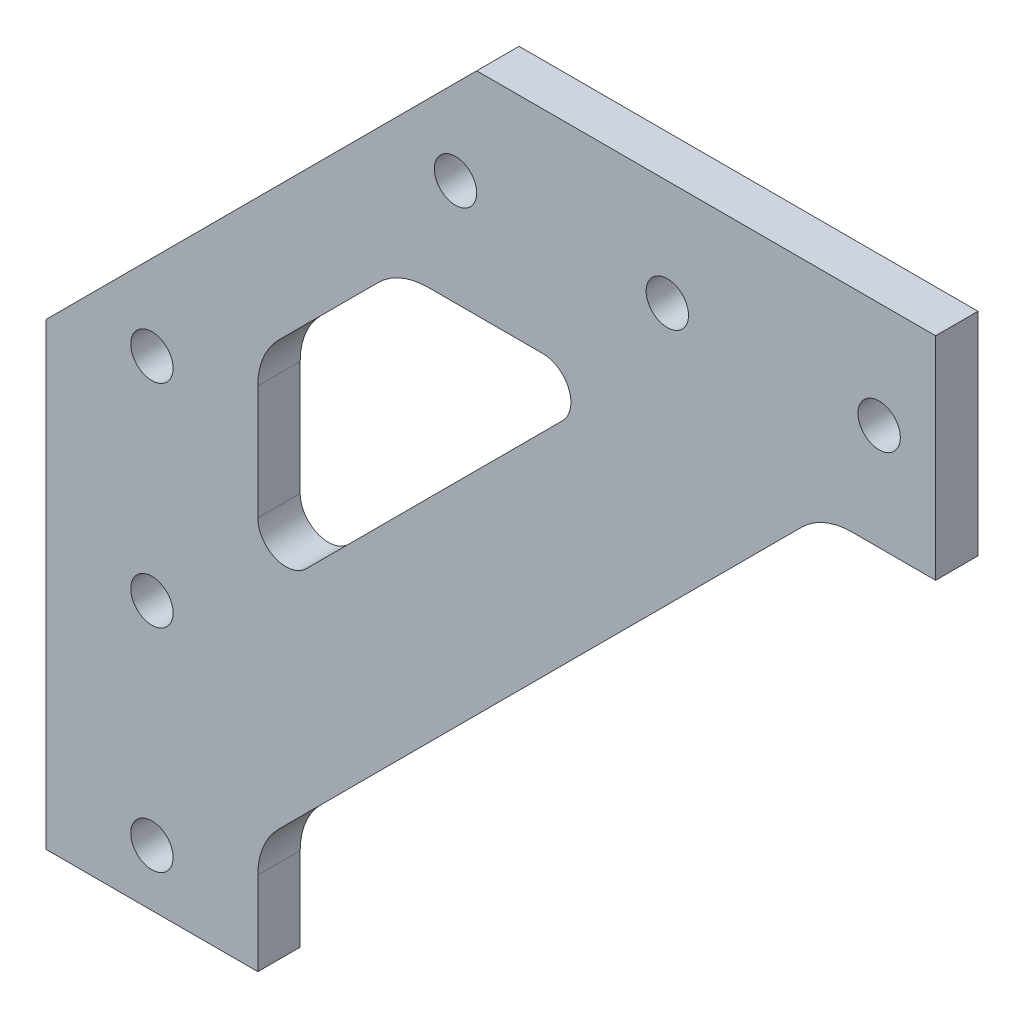
ISO-10303-21;
HEADER;
FILE_DESCRIPTION(('STEP AP214'),'2;1');
FILE_NAME('part.step','',(''),(''),'','','');
FILE_SCHEMA(('AUTOMOTIVE_DESIGN { 1 0 10303 214 1 1 1 1 }'));
ENDSEC;
DATA;
#1=APPLICATION_CONTEXT('core data for automotive mechanical design processes');
#2=APPLICATION_PROTOCOL_DEFINITION('international standard','automotive_design',2000,#1);
#3=PRODUCT_CONTEXT('',#1,'mechanical');
#4=PRODUCT('Part','Part','',(#3));
#5=PRODUCT_RELATED_PRODUCT_CATEGORY('part','',(#4));
#6=PRODUCT_DEFINITION_FORMATION('','',#4);
#7=PRODUCT_DEFINITION_CONTEXT('part definition',#1,'design');
#8=PRODUCT_DEFINITION('design','',#6,#7);
#9=PRODUCT_DEFINITION_SHAPE('','',#8);
#10=(LENGTH_UNIT() NAMED_UNIT(*) SI_UNIT(.MILLI.,.METRE.));
#11=(NAMED_UNIT(*) PLANE_ANGLE_UNIT() SI_UNIT($,.RADIAN.));
#12=(NAMED_UNIT(*) SI_UNIT($,.STERADIAN.) SOLID_ANGLE_UNIT());
#13=UNCERTAINTY_MEASURE_WITH_UNIT(LENGTH_MEASURE(1.E-05),#10,'distance_accuracy_value','');
#14=(GEOMETRIC_REPRESENTATION_CONTEXT(3) GLOBAL_UNCERTAINTY_ASSIGNED_CONTEXT((#13)) GLOBAL_UNIT_ASSIGNED_CONTEXT((#10,
#11,#12)) REPRESENTATION_CONTEXT('',''));
#15=CARTESIAN_POINT('',(0.,0.,0.));
#16=DIRECTION('',(0.,0.,1.));
#17=DIRECTION('',(1.,0.,0.));
#18=AXIS2_PLACEMENT_3D('',#15,#16,#17);
#19=CARTESIAN_POINT('',(26.5710678118655,-20.,3.));
#20=DIRECTION('',(0.,0.,1.));
#21=DIRECTION('',(1.,0.,0.));
#22=AXIS2_PLACEMENT_3D('',#19,#20,#21);
#23=PLANE('',#22);
#24=CARTESIAN_POINT('',(28.5,-7.5,3.));
#25=DIRECTION('',(0.,0.,1.));
#26=DIRECTION('',(1.,0.,0.));
#27=AXIS2_PLACEMENT_3D('',#24,#25,#26);
#28=CIRCLE('',#27,1.5);
#29=CARTESIAN_POINT('',(30.,-7.5,3.));
#30=VERTEX_POINT('',#29);
#31=EDGE_CURVE('E298',#30,#30,#28,.T.);
#32=ORIENTED_EDGE('',*,*,#31,.F.);
#33=EDGE_LOOP('',(#32));
#34=FACE_BOUND('',#33,.T.);
#35=CARTESIAN_POINT('',(13.5,-7.5,3.));
#36=DIRECTION('',(0.,0.,1.));
#37=DIRECTION('',(1.,0.,0.));
#38=AXIS2_PLACEMENT_3D('',#35,#36,#37);
#39=CIRCLE('',#38,1.5);
#40=CARTESIAN_POINT('',(15.,-7.5,3.));
#41=VERTEX_POINT('',#40);
#42=EDGE_CURVE('E479',#41,#41,#39,.T.);
#43=ORIENTED_EDGE('',*,*,#42,.F.);
#44=EDGE_LOOP('',(#43));
#45=FACE_BOUND('',#44,.T.);
#46=CARTESIAN_POINT('',(-1.5,-7.5,3.));
#47=DIRECTION('',(0.,0.,1.));
#48=DIRECTION('',(1.,0.,0.));
#49=AXIS2_PLACEMENT_3D('',#46,#47,#48);
#50=CIRCLE('',#49,1.5);
#51=CARTESIAN_POINT('',(0.,-7.5,3.));
#52=VERTEX_POINT('',#51);
#53=EDGE_CURVE('E466',#52,#52,#50,.T.);
#54=ORIENTED_EDGE('',*,*,#53,.F.);
#55=EDGE_LOOP('',(#54));
#56=FACE_BOUND('',#55,.T.);
#57=CARTESIAN_POINT('',(-22.9999999999998,-29.,3.));
#58=DIRECTION('',(0.,0.,1.));
#59=DIRECTION('',(1.,0.,0.));
#60=AXIS2_PLACEMENT_3D('',#57,#58,#59);
#61=CIRCLE('',#60,1.5);
#62=CARTESIAN_POINT('',(-21.4999999999998,-29.,3.));
#63=VERTEX_POINT('',#62);
#64=EDGE_CURVE('E480',#63,#63,#61,.T.);
#65=ORIENTED_EDGE('',*,*,#64,.F.);
#66=EDGE_LOOP('',(#65));
#67=FACE_BOUND('',#66,.T.);
#68=CARTESIAN_POINT('',(-22.9999999999998,-44.,3.));
#69=DIRECTION('',(0.,0.,1.));
#70=DIRECTION('',(1.,0.,0.));
#71=AXIS2_PLACEMENT_3D('',#68,#69,#70);
#72=CIRCLE('',#71,1.5);
#73=CARTESIAN_POINT('',(-21.4999999999998,-44.,3.));
#74=VERTEX_POINT('',#73);
#75=EDGE_CURVE('E485',#74,#74,#72,.T.);
#76=ORIENTED_EDGE('',*,*,#75,.F.);
#77=EDGE_LOOP('',(#76));
#78=FACE_BOUND('',#77,.T.);
#79=CARTESIAN_POINT('',(-22.9999999999998,-59.,3.));
#80=DIRECTION('',(0.,0.,1.));
#81=DIRECTION('',(1.,0.,0.));
#82=AXIS2_PLACEMENT_3D('',#79,#80,#81);
#83=CIRCLE('',#82,1.5);
#84=CARTESIAN_POINT('',(-21.4999999999998,-59.,3.));
#85=VERTEX_POINT('',#84);
#86=EDGE_CURVE('E490',#85,#85,#83,.T.);
#87=ORIENTED_EDGE('',*,*,#86,.F.);
#88=EDGE_LOOP('',(#87));
#89=FACE_BOUND('',#88,.T.);
#90=DIRECTION('',(-1.,0.,0.));
#91=VECTOR('',#90,1.);
#92=CARTESIAN_POINT('',(0.,0.,3.));
#93=LINE('',#92,#91);
#94=CARTESIAN_POINT('',(32.5,0.,3.));
#95=VERTEX_POINT('',#94);
#96=CARTESIAN_POINT('',(0.,0.,3.));
#97=VERTEX_POINT('',#96);
#98=EDGE_CURVE('E227',#95,#97,#93,.T.);
#99=ORIENTED_EDGE('',*,*,#98,.T.);
#100=DIRECTION('',(-0.707106781186546,-0.707106781186549,0.));
#101=VECTOR('',#100,1.);
#102=CARTESIAN_POINT('',(-30.4999999999998,-30.5,3.));
#103=LINE('',#102,#101);
#104=CARTESIAN_POINT('',(-30.4999999999998,-30.5,3.));
#105=VERTEX_POINT('',#104);
#106=EDGE_CURVE('E230',#97,#105,#103,.T.);
#107=ORIENTED_EDGE('',*,*,#106,.T.);
#108=DIRECTION('',(0.,-1.,0.));
#109=VECTOR('',#108,1.);
#110=CARTESIAN_POINT('',(-30.4999999999998,-30.5,3.));
#111=LINE('',#110,#109);
#112=CARTESIAN_POINT('',(-30.4999999999998,-63.,3.));
#113=VERTEX_POINT('',#112);
#114=EDGE_CURVE('E233',#105,#113,#111,.T.);
#115=ORIENTED_EDGE('',*,*,#114,.T.);
#116=DIRECTION('',(1.,0.,0.));
#117=VECTOR('',#116,1.);
#118=CARTESIAN_POINT('',(-15.4999999999998,-63.,3.));
#119=LINE('',#118,#117);
#120=CARTESIAN_POINT('',(-15.4999999999998,-63.,3.));
#121=VERTEX_POINT('',#120);
#122=EDGE_CURVE('E235',#113,#121,#119,.T.);
#123=ORIENTED_EDGE('',*,*,#122,.T.);
#124=DIRECTION('',(0.,1.,0.));
#125=VECTOR('',#124,1.);
#126=CARTESIAN_POINT('',(-15.4999999999998,-57.0710678118655,3.));
#127=LINE('',#126,#125);
#128=CARTESIAN_POINT('',(-15.4999999999998,-57.0710678118655,3.));
#129=VERTEX_POINT('',#128);
#130=EDGE_CURVE('E237',#121,#129,#127,.T.);
#131=ORIENTED_EDGE('',*,*,#130,.T.);
#132=CARTESIAN_POINT('',(-10.4999999999998,-57.0710678118655,3.));
#133=DIRECTION('',(0.,0.,-1.));
#134=DIRECTION('',(1.,0.,0.));
#135=AXIS2_PLACEMENT_3D('',#132,#133,#134);
#136=CIRCLE('',#135,5.);
#137=CARTESIAN_POINT('',(-14.0355339059325,-53.5355339059327,3.));
#138=VERTEX_POINT('',#137);
#139=EDGE_CURVE('E239',#129,#138,#136,.T.);
#140=ORIENTED_EDGE('',*,*,#139,.T.);
#141=DIRECTION('',(0.707106781186546,0.707106781186549,0.));
#142=VECTOR('',#141,1.);
#143=CARTESIAN_POINT('',(23.0355339059327,-16.4644660940673,3.));
#144=LINE('',#143,#142);
#145=CARTESIAN_POINT('',(23.0355339059327,-16.4644660940673,3.));
#146=VERTEX_POINT('',#145);
#147=EDGE_CURVE('E241',#138,#146,#144,.T.);
#148=ORIENTED_EDGE('',*,*,#147,.T.);
#149=CARTESIAN_POINT('',(26.5710678118655,-20.,3.));
#150=DIRECTION('',(0.,0.,-1.));
#151=DIRECTION('',(1.,0.,0.));
#152=AXIS2_PLACEMENT_3D('',#149,#150,#151);
#153=CIRCLE('',#152,5.);
#154=CARTESIAN_POINT('',(26.5710678118655,-15.,3.));
#155=VERTEX_POINT('',#154);
#156=EDGE_CURVE('E243',#146,#155,#153,.T.);
#157=ORIENTED_EDGE('',*,*,#156,.T.);
#158=DIRECTION('',(1.,0.,0.));
#159=VECTOR('',#158,1.);
#160=CARTESIAN_POINT('',(32.5,-15.,3.));
#161=LINE('',#160,#159);
#162=CARTESIAN_POINT('',(32.5,-15.,3.));
#163=VERTEX_POINT('',#162);
#164=EDGE_CURVE('E245',#155,#163,#161,.T.);
#165=ORIENTED_EDGE('',*,*,#164,.T.);
#166=DIRECTION('',(0.,1.,0.));
#167=VECTOR('',#166,1.);
#168=CARTESIAN_POINT('',(32.5,0.,3.));
#169=LINE('',#168,#167);
#170=EDGE_CURVE('E247',#163,#95,#169,.T.);
#171=ORIENTED_EDGE('',*,*,#170,.T.);
#172=EDGE_LOOP('',(#99,#107,#115,#123,#131,#140,#148,#157,#165,#171));
#173=FACE_BOUND('',#172,.T.);
#174=DIRECTION('',(0.707106781186545,0.70710678118655,0.));
#175=VECTOR('',#174,1.);
#176=CARTESIAN_POINT('',(-12.0857864376267,-36.5857864376269,3.));
#177=LINE('',#176,#175);
#178=CARTESIAN_POINT('',(-12.0857864376267,-36.5857864376269,3.));
#179=VERTEX_POINT('',#178);
#180=CARTESIAN_POINT('',(6.08578643762694,-18.4142135623731,3.));
#181=VERTEX_POINT('',#180);
#182=EDGE_CURVE('E169',#179,#181,#177,.T.);
#183=ORIENTED_EDGE('',*,*,#182,.F.);
#184=CARTESIAN_POINT('',(-13.4999999999998,-35.1715728752538,3.));
#185=DIRECTION('',(0.,0.,1.));
#186=DIRECTION('',(1.,0.,0.));
#187=AXIS2_PLACEMENT_3D('',#184,#185,#186);
#188=CIRCLE('',#187,2.);
#189=CARTESIAN_POINT('',(-15.4999999999998,-35.1715728752538,3.));
#190=VERTEX_POINT('',#189);
#191=EDGE_CURVE('E161',#190,#179,#188,.T.);
#192=ORIENTED_EDGE('',*,*,#191,.F.);
#193=DIRECTION('',(0.,-1.,0.));
#194=VECTOR('',#193,1.);
#195=CARTESIAN_POINT('',(-15.4999999999998,-35.1715728752538,3.));
#196=LINE('',#195,#194);
#197=CARTESIAN_POINT('',(-15.4999999999998,-27.0710678118654,3.));
#198=VERTEX_POINT('',#197);
#199=EDGE_CURVE('E195',#198,#190,#196,.T.);
#200=ORIENTED_EDGE('',*,*,#199,.F.);
#201=CARTESIAN_POINT('',(-10.4999999999998,-27.0710678118654,3.));
#202=DIRECTION('',(0.,0.,1.));
#203=DIRECTION('',(-1.,0.,0.));
#204=AXIS2_PLACEMENT_3D('',#201,#202,#203);
#205=CIRCLE('',#204,5.);
#206=CARTESIAN_POINT('',(-14.0355339059326,-23.5355339059327,3.));
#207=VERTEX_POINT('',#206);
#208=EDGE_CURVE('E193',#207,#198,#205,.T.);
#209=ORIENTED_EDGE('',*,*,#208,.F.);
#210=DIRECTION('',(-0.70710678118654,-0.707106781186555,0.));
#211=VECTOR('',#210,1.);
#212=CARTESIAN_POINT('',(-6.96446609406726,-16.4644660940673,3.));
#213=LINE('',#212,#211);
#214=CARTESIAN_POINT('',(-6.96446609406726,-16.4644660940673,3.));
#215=VERTEX_POINT('',#214);
#216=EDGE_CURVE('E191',#215,#207,#213,.T.);
#217=ORIENTED_EDGE('',*,*,#216,.F.);
#218=CARTESIAN_POINT('',(-3.42893218813449,-20.,3.));
#219=DIRECTION('',(0.,0.,1.));
#220=DIRECTION('',(1.,0.,0.));
#221=AXIS2_PLACEMENT_3D('',#218,#219,#220);
#222=CIRCLE('',#221,5.);
#223=CARTESIAN_POINT('',(-3.42893218813449,-15.,3.));
#224=VERTEX_POINT('',#223);
#225=EDGE_CURVE('E189',#224,#215,#222,.T.);
#226=ORIENTED_EDGE('',*,*,#225,.F.);
#227=DIRECTION('',(-1.,0.,0.));
#228=VECTOR('',#227,1.);
#229=CARTESIAN_POINT('',(4.67157287525384,-15.,3.));
#230=LINE('',#229,#228);
#231=CARTESIAN_POINT('',(4.67157287525384,-15.,3.));
#232=VERTEX_POINT('',#231);
#233=EDGE_CURVE('E184',#232,#224,#230,.T.);
#234=ORIENTED_EDGE('',*,*,#233,.F.);
#235=CARTESIAN_POINT('',(4.67157287525384,-17.,3.));
#236=DIRECTION('',(0.,0.,1.));
#237=DIRECTION('',(1.,0.,0.));
#238=AXIS2_PLACEMENT_3D('',#235,#236,#237);
#239=CIRCLE('',#238,2.);
#240=EDGE_CURVE('E182',#181,#232,#239,.T.);
#241=ORIENTED_EDGE('',*,*,#240,.F.);
#242=EDGE_LOOP('',(#183,#192,#200,#209,#217,#226,#234,#241));
#243=FACE_BOUND('',#242,.T.);
#244=ADVANCED_FACE('F34',(#34,#45,#56,#67,#78,#89,#173,#243),#23,.T.);
#245=CARTESIAN_POINT('',(26.5710678118655,-20.,0.));
#246=DIRECTION('',(0.,0.,1.));
#247=DIRECTION('',(1.,0.,0.));
#248=AXIS2_PLACEMENT_3D('',#245,#246,#247);
#249=PLANE('',#248);
#250=CARTESIAN_POINT('',(28.5,-7.5,0.));
#251=DIRECTION('',(0.,0.,1.));
#252=DIRECTION('',(1.,0.,0.));
#253=AXIS2_PLACEMENT_3D('',#250,#251,#252);
#254=CIRCLE('',#253,1.5);
#255=CARTESIAN_POINT('',(30.,-7.5,0.));
#256=VERTEX_POINT('',#255);
#257=EDGE_CURVE('E38',#256,#256,#254,.T.);
#258=ORIENTED_EDGE('',*,*,#257,.T.);
#259=EDGE_LOOP('',(#258));
#260=FACE_BOUND('',#259,.T.);
#261=CARTESIAN_POINT('',(13.5,-7.5,0.));
#262=DIRECTION('',(0.,0.,1.));
#263=DIRECTION('',(1.,0.,0.));
#264=AXIS2_PLACEMENT_3D('',#261,#262,#263);
#265=CIRCLE('',#264,1.5);
#266=CARTESIAN_POINT('',(15.,-7.5,0.));
#267=VERTEX_POINT('',#266);
#268=EDGE_CURVE('E306',#267,#267,#265,.T.);
#269=ORIENTED_EDGE('',*,*,#268,.T.);
#270=EDGE_LOOP('',(#269));
#271=FACE_BOUND('',#270,.T.);
#272=CARTESIAN_POINT('',(-1.5,-7.5,0.));
#273=DIRECTION('',(0.,0.,1.));
#274=DIRECTION('',(1.,0.,0.));
#275=AXIS2_PLACEMENT_3D('',#272,#273,#274);
#276=CIRCLE('',#275,1.5);
#277=CARTESIAN_POINT('',(0.,-7.5,0.));
#278=VERTEX_POINT('',#277);
#279=EDGE_CURVE('E304',#278,#278,#276,.T.);
#280=ORIENTED_EDGE('',*,*,#279,.T.);
#281=EDGE_LOOP('',(#280));
#282=FACE_BOUND('',#281,.T.);
#283=CARTESIAN_POINT('',(-22.9999999999998,-29.,0.));
#284=DIRECTION('',(0.,0.,1.));
#285=DIRECTION('',(1.,0.,0.));
#286=AXIS2_PLACEMENT_3D('',#283,#284,#285);
#287=CIRCLE('',#286,1.5);
#288=CARTESIAN_POINT('',(-21.4999999999998,-29.,0.));
#289=VERTEX_POINT('',#288);
#290=EDGE_CURVE('E301',#289,#289,#287,.T.);
#291=ORIENTED_EDGE('',*,*,#290,.T.);
#292=EDGE_LOOP('',(#291));
#293=FACE_BOUND('',#292,.T.);
#294=CARTESIAN_POINT('',(-22.9999999999998,-44.,0.));
#295=DIRECTION('',(0.,0.,1.));
#296=DIRECTION('',(1.,0.,0.));
#297=AXIS2_PLACEMENT_3D('',#294,#295,#296);
#298=CIRCLE('',#297,1.5);
#299=CARTESIAN_POINT('',(-21.4999999999998,-44.,0.));
#300=VERTEX_POINT('',#299);
#301=EDGE_CURVE('E297',#300,#300,#298,.T.);
#302=ORIENTED_EDGE('',*,*,#301,.T.);
#303=EDGE_LOOP('',(#302));
#304=FACE_BOUND('',#303,.T.);
#305=CARTESIAN_POINT('',(-22.9999999999998,-59.,0.));
#306=DIRECTION('',(0.,0.,1.));
#307=DIRECTION('',(1.,0.,0.));
#308=AXIS2_PLACEMENT_3D('',#305,#306,#307);
#309=CIRCLE('',#308,1.5);
#310=CARTESIAN_POINT('',(-21.4999999999998,-59.,0.));
#311=VERTEX_POINT('',#310);
#312=EDGE_CURVE('E294',#311,#311,#309,.T.);
#313=ORIENTED_EDGE('',*,*,#312,.T.);
#314=EDGE_LOOP('',(#313));
#315=FACE_BOUND('',#314,.T.);
#316=DIRECTION('',(-1.,0.,0.));
#317=VECTOR('',#316,1.);
#318=CARTESIAN_POINT('',(0.,0.,0.));
#319=LINE('',#318,#317);
#320=CARTESIAN_POINT('',(32.5,0.,0.));
#321=VERTEX_POINT('',#320);
#322=CARTESIAN_POINT('',(0.,0.,0.));
#323=VERTEX_POINT('',#322);
#324=EDGE_CURVE('E177',#321,#323,#319,.T.);
#325=ORIENTED_EDGE('',*,*,#324,.F.);
#326=DIRECTION('',(0.,1.,0.));
#327=VECTOR('',#326,1.);
#328=CARTESIAN_POINT('',(32.5,0.,0.));
#329=LINE('',#328,#327);
#330=CARTESIAN_POINT('',(32.5,-15.,0.));
#331=VERTEX_POINT('',#330);
#332=EDGE_CURVE('E231',#331,#321,#329,.T.);
#333=ORIENTED_EDGE('',*,*,#332,.F.);
#334=DIRECTION('',(1.,0.,0.));
#335=VECTOR('',#334,1.);
#336=CARTESIAN_POINT('',(32.5,-15.,0.));
#337=LINE('',#336,#335);
#338=CARTESIAN_POINT('',(26.5710678118655,-15.,0.));
#339=VERTEX_POINT('',#338);
#340=EDGE_CURVE('E266',#339,#331,#337,.T.);
#341=ORIENTED_EDGE('',*,*,#340,.F.);
#342=CARTESIAN_POINT('',(26.5710678118655,-20.,0.));
#343=DIRECTION('',(0.,0.,-1.));
#344=DIRECTION('',(1.,0.,0.));
#345=AXIS2_PLACEMENT_3D('',#342,#343,#344);
#346=CIRCLE('',#345,5.);
#347=CARTESIAN_POINT('',(23.0355339059327,-16.4644660940673,0.));
#348=VERTEX_POINT('',#347);
#349=EDGE_CURVE('E264',#348,#339,#346,.T.);
#350=ORIENTED_EDGE('',*,*,#349,.F.);
#351=DIRECTION('',(0.707106781186546,0.707106781186549,0.));
#352=VECTOR('',#351,1.);
#353=CARTESIAN_POINT('',(23.0355339059327,-16.4644660940673,0.));
#354=LINE('',#353,#352);
#355=CARTESIAN_POINT('',(-14.0355339059325,-53.5355339059327,0.));
#356=VERTEX_POINT('',#355);
#357=EDGE_CURVE('E262',#356,#348,#354,.T.);
#358=ORIENTED_EDGE('',*,*,#357,.F.);
#359=CARTESIAN_POINT('',(-10.4999999999998,-57.0710678118655,0.));
#360=DIRECTION('',(0.,0.,-1.));
#361=DIRECTION('',(1.,0.,0.));
#362=AXIS2_PLACEMENT_3D('',#359,#360,#361);
#363=CIRCLE('',#362,5.);
#364=CARTESIAN_POINT('',(-15.4999999999998,-57.0710678118655,0.));
#365=VERTEX_POINT('',#364);
#366=EDGE_CURVE('E260',#365,#356,#363,.T.);
#367=ORIENTED_EDGE('',*,*,#366,.F.);
#368=DIRECTION('',(0.,1.,0.));
#369=VECTOR('',#368,1.);
#370=CARTESIAN_POINT('',(-15.4999999999998,-57.0710678118655,0.));
#371=LINE('',#370,#369);
#372=CARTESIAN_POINT('',(-15.4999999999998,-63.,0.));
#373=VERTEX_POINT('',#372);
#374=EDGE_CURVE('E258',#373,#365,#371,.T.);
#375=ORIENTED_EDGE('',*,*,#374,.F.);
#376=DIRECTION('',(1.,0.,0.));
#377=VECTOR('',#376,1.);
#378=CARTESIAN_POINT('',(-15.4999999999998,-63.,0.));
#379=LINE('',#378,#377);
#380=CARTESIAN_POINT('',(-30.4999999999998,-63.,0.));
#381=VERTEX_POINT('',#380);
#382=EDGE_CURVE('E256',#381,#373,#379,.T.);
#383=ORIENTED_EDGE('',*,*,#382,.F.);
#384=DIRECTION('',(0.,-1.,0.));
#385=VECTOR('',#384,1.);
#386=CARTESIAN_POINT('',(-30.4999999999998,-30.5,0.));
#387=LINE('',#386,#385);
#388=CARTESIAN_POINT('',(-30.4999999999998,-30.5,0.));
#389=VERTEX_POINT('',#388);
#390=EDGE_CURVE('E254',#389,#381,#387,.T.);
#391=ORIENTED_EDGE('',*,*,#390,.F.);
#392=DIRECTION('',(-0.707106781186546,-0.707106781186549,0.));
#393=VECTOR('',#392,1.);
#394=CARTESIAN_POINT('',(-30.4999999999998,-30.5,0.));
#395=LINE('',#394,#393);
#396=EDGE_CURVE('E252',#323,#389,#395,.T.);
#397=ORIENTED_EDGE('',*,*,#396,.F.);
#398=EDGE_LOOP('',(#325,#333,#341,#350,#358,#367,#375,#383,#391,#397));
#399=FACE_BOUND('',#398,.T.);
#400=CARTESIAN_POINT('',(-13.4999999999998,-35.1715728752538,0.));
#401=DIRECTION('',(0.,0.,1.));
#402=DIRECTION('',(1.,0.,0.));
#403=AXIS2_PLACEMENT_3D('',#400,#401,#402);
#404=CIRCLE('',#403,2.);
#405=CARTESIAN_POINT('',(-15.4999999999998,-35.1715728752538,0.));
#406=VERTEX_POINT('',#405);
#407=CARTESIAN_POINT('',(-12.0857864376267,-36.5857864376269,0.));
#408=VERTEX_POINT('',#407);
#409=EDGE_CURVE('E59',#406,#408,#404,.T.);
#410=ORIENTED_EDGE('',*,*,#409,.T.);
#411=DIRECTION('',(0.707106781186545,0.70710678118655,0.));
#412=VECTOR('',#411,1.);
#413=CARTESIAN_POINT('',(-12.0857864376267,-36.5857864376269,0.));
#414=LINE('',#413,#412);
#415=CARTESIAN_POINT('',(6.08578643762694,-18.4142135623731,0.));
#416=VERTEX_POINT('',#415);
#417=EDGE_CURVE('E176',#408,#416,#414,.T.);
#418=ORIENTED_EDGE('',*,*,#417,.T.);
#419=CARTESIAN_POINT('',(4.67157287525384,-17.,0.));
#420=DIRECTION('',(0.,0.,1.));
#421=DIRECTION('',(1.,0.,0.));
#422=AXIS2_PLACEMENT_3D('',#419,#420,#421);
#423=CIRCLE('',#422,2.);
#424=CARTESIAN_POINT('',(4.67157287525384,-15.,0.));
#425=VERTEX_POINT('',#424);
#426=EDGE_CURVE('E199',#416,#425,#423,.T.);
#427=ORIENTED_EDGE('',*,*,#426,.T.);
#428=DIRECTION('',(-1.,0.,0.));
#429=VECTOR('',#428,1.);
#430=CARTESIAN_POINT('',(4.67157287525384,-15.,0.));
#431=LINE('',#430,#429);
#432=CARTESIAN_POINT('',(-3.42893218813449,-15.,0.));
#433=VERTEX_POINT('',#432);
#434=EDGE_CURVE('E202',#425,#433,#431,.T.);
#435=ORIENTED_EDGE('',*,*,#434,.T.);
#436=CARTESIAN_POINT('',(-3.42893218813449,-20.,0.));
#437=DIRECTION('',(0.,0.,1.));
#438=DIRECTION('',(1.,0.,0.));
#439=AXIS2_PLACEMENT_3D('',#436,#437,#438);
#440=CIRCLE('',#439,5.);
#441=CARTESIAN_POINT('',(-6.96446609406726,-16.4644660940673,0.));
#442=VERTEX_POINT('',#441);
#443=EDGE_CURVE('E205',#433,#442,#440,.T.);
#444=ORIENTED_EDGE('',*,*,#443,.T.);
#445=DIRECTION('',(-0.70710678118654,-0.707106781186555,0.));
#446=VECTOR('',#445,1.);
#447=CARTESIAN_POINT('',(-6.96446609406726,-16.4644660940673,0.));
#448=LINE('',#447,#446);
#449=CARTESIAN_POINT('',(-14.0355339059326,-23.5355339059327,0.));
#450=VERTEX_POINT('',#449);
#451=EDGE_CURVE('E208',#442,#450,#448,.T.);
#452=ORIENTED_EDGE('',*,*,#451,.T.);
#453=CARTESIAN_POINT('',(-10.4999999999998,-27.0710678118654,0.));
#454=DIRECTION('',(0.,0.,1.));
#455=DIRECTION('',(-1.,0.,0.));
#456=AXIS2_PLACEMENT_3D('',#453,#454,#455);
#457=CIRCLE('',#456,5.);
#458=CARTESIAN_POINT('',(-15.4999999999998,-27.0710678118654,0.));
#459=VERTEX_POINT('',#458);
#460=EDGE_CURVE('E211',#450,#459,#457,.T.);
#461=ORIENTED_EDGE('',*,*,#460,.T.);
#462=DIRECTION('',(0.,-1.,0.));
#463=VECTOR('',#462,1.);
#464=CARTESIAN_POINT('',(-15.4999999999998,-35.1715728752538,0.));
#465=LINE('',#464,#463);
#466=EDGE_CURVE('E170',#459,#406,#465,.T.);
#467=ORIENTED_EDGE('',*,*,#466,.T.);
#468=EDGE_LOOP('',(#410,#418,#427,#435,#444,#452,#461,#467));
#469=FACE_BOUND('',#468,.T.);
#470=ADVANCED_FACE('F313',(#260,#271,#282,#293,#304,#315,#399,#469),#249,.F.);
#471=CARTESIAN_POINT('',(0.,0.,3.));
#472=DIRECTION('',(0.,-1.,0.));
#473=DIRECTION('',(0.,0.,-1.));
#474=AXIS2_PLACEMENT_3D('',#471,#472,#473);
#475=PLANE('',#474);
#476=ORIENTED_EDGE('',*,*,#324,.T.);
#477=DIRECTION('',(0.,0.,-1.));
#478=VECTOR('',#477,1.);
#479=CARTESIAN_POINT('',(0.,0.,3.));
#480=LINE('',#479,#478);
#481=EDGE_CURVE('E11',#97,#323,#480,.T.);
#482=ORIENTED_EDGE('',*,*,#481,.F.);
#483=ORIENTED_EDGE('',*,*,#98,.F.);
#484=DIRECTION('',(0.,0.,-1.));
#485=VECTOR('',#484,1.);
#486=CARTESIAN_POINT('',(32.5,0.,3.));
#487=LINE('',#486,#485);
#488=EDGE_CURVE('E249',#95,#321,#487,.T.);
#489=ORIENTED_EDGE('',*,*,#488,.T.);
#490=EDGE_LOOP('',(#476,#482,#483,#489));
#491=FACE_BOUND('',#490,.T.);
#492=ADVANCED_FACE('F36',(#491),#475,.F.);
#493=CARTESIAN_POINT('',(-30.4999999999998,-30.5,3.));
#494=DIRECTION('',(0.707106781186549,-0.707106781186545,0.));
#495=DIRECTION('',(0.707106781186546,0.707106781186549,0.));
#496=AXIS2_PLACEMENT_3D('',#493,#494,#495);
#497=PLANE('',#496);
#498=ORIENTED_EDGE('',*,*,#396,.T.);
#499=DIRECTION('',(0.,0.,-1.));
#500=VECTOR('',#499,1.);
#501=CARTESIAN_POINT('',(-30.4999999999998,-30.5,3.));
#502=LINE('',#501,#500);
#503=EDGE_CURVE('E43',#105,#389,#502,.T.);
#504=ORIENTED_EDGE('',*,*,#503,.F.);
#505=ORIENTED_EDGE('',*,*,#106,.F.);
#506=ORIENTED_EDGE('',*,*,#481,.T.);
#507=EDGE_LOOP('',(#498,#504,#505,#506));
#508=FACE_BOUND('',#507,.T.);
#509=ADVANCED_FACE('F369',(#508),#497,.F.);
#510=CARTESIAN_POINT('',(-30.4999999999998,-30.5,3.));
#511=DIRECTION('',(1.,0.,0.));
#512=DIRECTION('',(0.,1.,0.));
#513=AXIS2_PLACEMENT_3D('',#510,#511,#512);
#514=PLANE('',#513);
#515=ORIENTED_EDGE('',*,*,#390,.T.);
#516=DIRECTION('',(0.,0.,-1.));
#517=VECTOR('',#516,1.);
#518=CARTESIAN_POINT('',(-30.4999999999998,-63.,3.));
#519=LINE('',#518,#517);
#520=EDGE_CURVE('E289',#113,#381,#519,.T.);
#521=ORIENTED_EDGE('',*,*,#520,.F.);
#522=ORIENTED_EDGE('',*,*,#114,.F.);
#523=ORIENTED_EDGE('',*,*,#503,.T.);
#524=EDGE_LOOP('',(#515,#521,#522,#523));
#525=FACE_BOUND('',#524,.T.);
#526=ADVANCED_FACE('F366',(#525),#514,.F.);
#527=CARTESIAN_POINT('',(-15.4999999999998,-63.,3.));
#528=DIRECTION('',(0.,1.,0.));
#529=DIRECTION('',(-1.,0.,0.));
#530=AXIS2_PLACEMENT_3D('',#527,#528,#529);
#531=PLANE('',#530);
#532=ORIENTED_EDGE('',*,*,#382,.T.);
#533=DIRECTION('',(0.,0.,-1.));
#534=VECTOR('',#533,1.);
#535=CARTESIAN_POINT('',(-15.4999999999998,-63.,3.));
#536=LINE('',#535,#534);
#537=EDGE_CURVE('E286',#121,#373,#536,.T.);
#538=ORIENTED_EDGE('',*,*,#537,.F.);
#539=ORIENTED_EDGE('',*,*,#122,.F.);
#540=ORIENTED_EDGE('',*,*,#520,.T.);
#541=EDGE_LOOP('',(#532,#538,#539,#540));
#542=FACE_BOUND('',#541,.T.);
#543=ADVANCED_FACE('F362',(#542),#531,.F.);
#544=CARTESIAN_POINT('',(-15.4999999999998,-57.0710678118655,3.));
#545=DIRECTION('',(-1.,0.,0.));
#546=DIRECTION('',(0.,-1.,0.));
#547=AXIS2_PLACEMENT_3D('',#544,#545,#546);
#548=PLANE('',#547);
#549=ORIENTED_EDGE('',*,*,#374,.T.);
#550=DIRECTION('',(0.,0.,-1.));
#551=VECTOR('',#550,1.);
#552=CARTESIAN_POINT('',(-15.4999999999998,-57.0710678118655,3.));
#553=LINE('',#552,#551);
#554=EDGE_CURVE('E283',#129,#365,#553,.T.);
#555=ORIENTED_EDGE('',*,*,#554,.F.);
#556=ORIENTED_EDGE('',*,*,#130,.F.);
#557=ORIENTED_EDGE('',*,*,#537,.T.);
#558=EDGE_LOOP('',(#549,#555,#556,#557));
#559=FACE_BOUND('',#558,.T.);
#560=ADVANCED_FACE('F358',(#559),#548,.F.);
#561=CARTESIAN_POINT('',(-10.4999999999998,-57.0710678118655,3.));
#562=DIRECTION('',(0.,0.,-1.));
#563=DIRECTION('',(-1.,0.,0.));
#564=AXIS2_PLACEMENT_3D('',#561,#562,#563);
#565=CYLINDRICAL_SURFACE('',#564,5.);
#566=ORIENTED_EDGE('',*,*,#366,.T.);
#567=DIRECTION('',(0.,0.,-1.));
#568=VECTOR('',#567,1.);
#569=CARTESIAN_POINT('',(-14.0355339059325,-53.5355339059327,3.));
#570=LINE('',#569,#568);
#571=EDGE_CURVE('E280',#138,#356,#570,.T.);
#572=ORIENTED_EDGE('',*,*,#571,.F.);
#573=ORIENTED_EDGE('',*,*,#139,.F.);
#574=ORIENTED_EDGE('',*,*,#554,.T.);
#575=EDGE_LOOP('',(#566,#572,#573,#574));
#576=FACE_BOUND('',#575,.T.);
#577=ADVANCED_FACE('F354',(#576),#565,.F.);
#578=CARTESIAN_POINT('',(23.0355339059327,-16.4644660940673,3.));
#579=DIRECTION('',(-0.707106781186549,0.707106781186546,0.));
#580=DIRECTION('',(-0.707106781186546,-0.707106781186549,0.));
#581=AXIS2_PLACEMENT_3D('',#578,#579,#580);
#582=PLANE('',#581);
#583=ORIENTED_EDGE('',*,*,#357,.T.);
#584=DIRECTION('',(0.,0.,-1.));
#585=VECTOR('',#584,1.);
#586=CARTESIAN_POINT('',(23.0355339059327,-16.4644660940673,3.));
#587=LINE('',#586,#585);
#588=EDGE_CURVE('E277',#146,#348,#587,.T.);
#589=ORIENTED_EDGE('',*,*,#588,.F.);
#590=ORIENTED_EDGE('',*,*,#147,.F.);
#591=ORIENTED_EDGE('',*,*,#571,.T.);
#592=EDGE_LOOP('',(#583,#589,#590,#591));
#593=FACE_BOUND('',#592,.T.);
#594=ADVANCED_FACE('F350',(#593),#582,.F.);
#595=CARTESIAN_POINT('',(26.5710678118655,-20.,3.));
#596=DIRECTION('',(0.,0.,-1.));
#597=DIRECTION('',(-1.,0.,0.));
#598=AXIS2_PLACEMENT_3D('',#595,#596,#597);
#599=CYLINDRICAL_SURFACE('',#598,5.);
#600=ORIENTED_EDGE('',*,*,#349,.T.);
#601=DIRECTION('',(0.,0.,-1.));
#602=VECTOR('',#601,1.);
#603=CARTESIAN_POINT('',(26.5710678118655,-15.,3.));
#604=LINE('',#603,#602);
#605=EDGE_CURVE('E274',#155,#339,#604,.T.);
#606=ORIENTED_EDGE('',*,*,#605,.F.);
#607=ORIENTED_EDGE('',*,*,#156,.F.);
#608=ORIENTED_EDGE('',*,*,#588,.T.);
#609=EDGE_LOOP('',(#600,#606,#607,#608));
#610=FACE_BOUND('',#609,.T.);
#611=ADVANCED_FACE('F346',(#610),#599,.F.);
#612=CARTESIAN_POINT('',(32.5,-15.,3.));
#613=DIRECTION('',(0.,1.,0.));
#614=DIRECTION('',(0.,0.,1.));
#615=AXIS2_PLACEMENT_3D('',#612,#613,#614);
#616=PLANE('',#615);
#617=ORIENTED_EDGE('',*,*,#340,.T.);
#618=DIRECTION('',(0.,0.,-1.));
#619=VECTOR('',#618,1.);
#620=CARTESIAN_POINT('',(32.5,-15.,3.));
#621=LINE('',#620,#619);
#622=EDGE_CURVE('E271',#163,#331,#621,.T.);
#623=ORIENTED_EDGE('',*,*,#622,.F.);
#624=ORIENTED_EDGE('',*,*,#164,.F.);
#625=ORIENTED_EDGE('',*,*,#605,.T.);
#626=EDGE_LOOP('',(#617,#623,#624,#625));
#627=FACE_BOUND('',#626,.T.);
#628=ADVANCED_FACE('F342',(#627),#616,.F.);
#629=CARTESIAN_POINT('',(32.5,0.,3.));
#630=DIRECTION('',(-1.,0.,0.));
#631=DIRECTION('',(0.,0.,1.));
#632=AXIS2_PLACEMENT_3D('',#629,#630,#631);
#633=PLANE('',#632);
#634=ORIENTED_EDGE('',*,*,#332,.T.);
#635=ORIENTED_EDGE('',*,*,#488,.F.);
#636=ORIENTED_EDGE('',*,*,#170,.F.);
#637=ORIENTED_EDGE('',*,*,#622,.T.);
#638=EDGE_LOOP('',(#634,#635,#636,#637));
#639=FACE_BOUND('',#638,.T.);
#640=ADVANCED_FACE('F339',(#639),#633,.F.);
#641=CARTESIAN_POINT('',(-13.4999999999998,-35.1715728752538,3.));
#642=DIRECTION('',(0.,0.,-1.));
#643=DIRECTION('',(-1.,0.,0.));
#644=AXIS2_PLACEMENT_3D('',#641,#642,#643);
#645=CYLINDRICAL_SURFACE('',#644,2.);
#646=ORIENTED_EDGE('',*,*,#409,.F.);
#647=DIRECTION('',(0.,0.,-1.));
#648=VECTOR('',#647,1.);
#649=CARTESIAN_POINT('',(-15.4999999999998,-35.1715728752538,3.));
#650=LINE('',#649,#648);
#651=EDGE_CURVE('E165',#190,#406,#650,.T.);
#652=ORIENTED_EDGE('',*,*,#651,.F.);
#653=ORIENTED_EDGE('',*,*,#191,.T.);
#654=DIRECTION('',(0.,0.,-1.));
#655=VECTOR('',#654,1.);
#656=CARTESIAN_POINT('',(-12.0857864376267,-36.5857864376269,3.));
#657=LINE('',#656,#655);
#658=EDGE_CURVE('E164',#179,#408,#657,.T.);
#659=ORIENTED_EDGE('',*,*,#658,.T.);
#660=EDGE_LOOP('',(#646,#652,#653,#659));
#661=FACE_BOUND('',#660,.T.);
#662=ADVANCED_FACE('F163',(#661),#645,.F.);
#663=CARTESIAN_POINT('',(-12.0857864376267,-36.5857864376269,3.));
#664=DIRECTION('',(-0.70710678118655,0.707106781186545,0.));
#665=DIRECTION('',(-0.707106781186545,-0.70710678118655,0.));
#666=AXIS2_PLACEMENT_3D('',#663,#664,#665);
#667=PLANE('',#666);
#668=ORIENTED_EDGE('',*,*,#417,.F.);
#669=ORIENTED_EDGE('',*,*,#658,.F.);
#670=ORIENTED_EDGE('',*,*,#182,.T.);
#671=DIRECTION('',(0.,0.,-1.));
#672=VECTOR('',#671,1.);
#673=CARTESIAN_POINT('',(6.08578643762694,-18.4142135623731,3.));
#674=LINE('',#673,#672);
#675=EDGE_CURVE('E178',#181,#416,#674,.T.);
#676=ORIENTED_EDGE('',*,*,#675,.T.);
#677=EDGE_LOOP('',(#668,#669,#670,#676));
#678=FACE_BOUND('',#677,.T.);
#679=ADVANCED_FACE('F173',(#678),#667,.T.);
#680=CARTESIAN_POINT('',(4.67157287525384,-17.,3.));
#681=DIRECTION('',(0.,0.,-1.));
#682=DIRECTION('',(-1.,0.,0.));
#683=AXIS2_PLACEMENT_3D('',#680,#681,#682);
#684=CYLINDRICAL_SURFACE('',#683,2.);
#685=ORIENTED_EDGE('',*,*,#426,.F.);
#686=ORIENTED_EDGE('',*,*,#675,.F.);
#687=ORIENTED_EDGE('',*,*,#240,.T.);
#688=DIRECTION('',(0.,0.,-1.));
#689=VECTOR('',#688,1.);
#690=CARTESIAN_POINT('',(4.67157287525384,-15.,3.));
#691=LINE('',#690,#689);
#692=EDGE_CURVE('E224',#232,#425,#691,.T.);
#693=ORIENTED_EDGE('',*,*,#692,.T.);
#694=EDGE_LOOP('',(#685,#686,#687,#693));
#695=FACE_BOUND('',#694,.T.);
#696=ADVANCED_FACE('F430',(#695),#684,.F.);
#697=CARTESIAN_POINT('',(4.67157287525384,-15.,3.));
#698=DIRECTION('',(0.,-1.,0.));
#699=DIRECTION('',(0.,0.,-1.));
#700=AXIS2_PLACEMENT_3D('',#697,#698,#699);
#701=PLANE('',#700);
#702=ORIENTED_EDGE('',*,*,#434,.F.);
#703=ORIENTED_EDGE('',*,*,#692,.F.);
#704=ORIENTED_EDGE('',*,*,#233,.T.);
#705=DIRECTION('',(0.,0.,-1.));
#706=VECTOR('',#705,1.);
#707=CARTESIAN_POINT('',(-3.42893218813449,-15.,3.));
#708=LINE('',#707,#706);
#709=EDGE_CURVE('E222',#224,#433,#708,.T.);
#710=ORIENTED_EDGE('',*,*,#709,.T.);
#711=EDGE_LOOP('',(#702,#703,#704,#710));
#712=FACE_BOUND('',#711,.T.);
#713=ADVANCED_FACE('F427',(#712),#701,.T.);
#714=CARTESIAN_POINT('',(-3.42893218813449,-20.,3.));
#715=DIRECTION('',(0.,0.,-1.));
#716=DIRECTION('',(-1.,0.,0.));
#717=AXIS2_PLACEMENT_3D('',#714,#715,#716);
#718=CYLINDRICAL_SURFACE('',#717,5.);
#719=ORIENTED_EDGE('',*,*,#443,.F.);
#720=ORIENTED_EDGE('',*,*,#709,.F.);
#721=ORIENTED_EDGE('',*,*,#225,.T.);
#722=DIRECTION('',(0.,0.,-1.));
#723=VECTOR('',#722,1.);
#724=CARTESIAN_POINT('',(-6.96446609406726,-16.4644660940673,3.));
#725=LINE('',#724,#723);
#726=EDGE_CURVE('E220',#215,#442,#725,.T.);
#727=ORIENTED_EDGE('',*,*,#726,.T.);
#728=EDGE_LOOP('',(#719,#720,#721,#727));
#729=FACE_BOUND('',#728,.T.);
#730=ADVANCED_FACE('F422',(#729),#718,.F.);
#731=CARTESIAN_POINT('',(-6.96446609406726,-16.4644660940673,3.));
#732=DIRECTION('',(0.707106781186555,-0.70710678118654,0.));
#733=DIRECTION('',(0.70710678118654,0.707106781186555,0.));
#734=AXIS2_PLACEMENT_3D('',#731,#732,#733);
#735=PLANE('',#734);
#736=ORIENTED_EDGE('',*,*,#451,.F.);
#737=ORIENTED_EDGE('',*,*,#726,.F.);
#738=ORIENTED_EDGE('',*,*,#216,.T.);
#739=DIRECTION('',(0.,0.,-1.));
#740=VECTOR('',#739,1.);
#741=CARTESIAN_POINT('',(-14.0355339059326,-23.5355339059327,3.));
#742=LINE('',#741,#740);
#743=EDGE_CURVE('E218',#207,#450,#742,.T.);
#744=ORIENTED_EDGE('',*,*,#743,.T.);
#745=EDGE_LOOP('',(#736,#737,#738,#744));
#746=FACE_BOUND('',#745,.T.);
#747=ADVANCED_FACE('F418',(#746),#735,.T.);
#748=CARTESIAN_POINT('',(-10.4999999999998,-27.0710678118654,3.));
#749=DIRECTION('',(0.,0.,-1.));
#750=DIRECTION('',(-1.,0.,0.));
#751=AXIS2_PLACEMENT_3D('',#748,#749,#750);
#752=CYLINDRICAL_SURFACE('',#751,5.);
#753=ORIENTED_EDGE('',*,*,#460,.F.);
#754=ORIENTED_EDGE('',*,*,#743,.F.);
#755=ORIENTED_EDGE('',*,*,#208,.T.);
#756=DIRECTION('',(0.,0.,-1.));
#757=VECTOR('',#756,1.);
#758=CARTESIAN_POINT('',(-15.4999999999998,-27.0710678118654,3.));
#759=LINE('',#758,#757);
#760=EDGE_CURVE('E51',#198,#459,#759,.T.);
#761=ORIENTED_EDGE('',*,*,#760,.T.);
#762=EDGE_LOOP('',(#753,#754,#755,#761));
#763=FACE_BOUND('',#762,.T.);
#764=ADVANCED_FACE('F415',(#763),#752,.F.);
#765=CARTESIAN_POINT('',(-15.4999999999998,-35.1715728752538,3.));
#766=DIRECTION('',(1.,0.,0.));
#767=DIRECTION('',(0.,0.,-1.));
#768=AXIS2_PLACEMENT_3D('',#765,#766,#767);
#769=PLANE('',#768);
#770=ORIENTED_EDGE('',*,*,#466,.F.);
#771=ORIENTED_EDGE('',*,*,#760,.F.);
#772=ORIENTED_EDGE('',*,*,#199,.T.);
#773=ORIENTED_EDGE('',*,*,#651,.T.);
#774=EDGE_LOOP('',(#770,#771,#772,#773));
#775=FACE_BOUND('',#774,.T.);
#776=ADVANCED_FACE('F409',(#775),#769,.T.);
#777=CARTESIAN_POINT('',(-22.9999999999998,-59.,-7.));
#778=DIRECTION('',(0.,0.,1.));
#779=DIRECTION('',(1.,0.,0.));
#780=AXIS2_PLACEMENT_3D('',#777,#778,#779);
#781=CYLINDRICAL_SURFACE('',#780,1.5);
#782=ORIENTED_EDGE('',*,*,#86,.T.);
#783=EDGE_LOOP('',(#782));
#784=FACE_BOUND('',#783,.T.);
#785=ORIENTED_EDGE('',*,*,#312,.F.);
#786=EDGE_LOOP('',(#785));
#787=FACE_BOUND('',#786,.T.);
#788=ADVANCED_FACE('F447',(#784,#787),#781,.F.);
#789=CARTESIAN_POINT('',(-22.9999999999998,-44.,-7.));
#790=DIRECTION('',(0.,0.,1.));
#791=DIRECTION('',(1.,0.,0.));
#792=AXIS2_PLACEMENT_3D('',#789,#790,#791);
#793=CYLINDRICAL_SURFACE('',#792,1.5);
#794=ORIENTED_EDGE('',*,*,#75,.T.);
#795=EDGE_LOOP('',(#794));
#796=FACE_BOUND('',#795,.T.);
#797=ORIENTED_EDGE('',*,*,#301,.F.);
#798=EDGE_LOOP('',(#797));
#799=FACE_BOUND('',#798,.T.);
#800=ADVANCED_FACE('F450',(#796,#799),#793,.F.);
#801=CARTESIAN_POINT('',(-22.9999999999998,-29.,-7.));
#802=DIRECTION('',(0.,0.,1.));
#803=DIRECTION('',(1.,0.,0.));
#804=AXIS2_PLACEMENT_3D('',#801,#802,#803);
#805=CYLINDRICAL_SURFACE('',#804,1.5);
#806=ORIENTED_EDGE('',*,*,#64,.T.);
#807=EDGE_LOOP('',(#806));
#808=FACE_BOUND('',#807,.T.);
#809=ORIENTED_EDGE('',*,*,#290,.F.);
#810=EDGE_LOOP('',(#809));
#811=FACE_BOUND('',#810,.T.);
#812=ADVANCED_FACE('F454',(#808,#811),#805,.F.);
#813=CARTESIAN_POINT('',(-1.5,-7.5,-7.));
#814=DIRECTION('',(0.,0.,1.));
#815=DIRECTION('',(1.,0.,0.));
#816=AXIS2_PLACEMENT_3D('',#813,#814,#815);
#817=CYLINDRICAL_SURFACE('',#816,1.5);
#818=ORIENTED_EDGE('',*,*,#53,.T.);
#819=EDGE_LOOP('',(#818));
#820=FACE_BOUND('',#819,.T.);
#821=ORIENTED_EDGE('',*,*,#279,.F.);
#822=EDGE_LOOP('',(#821));
#823=FACE_BOUND('',#822,.T.);
#824=ADVANCED_FACE('F323',(#820,#823),#817,.F.);
#825=CARTESIAN_POINT('',(13.5,-7.5,-7.));
#826=DIRECTION('',(0.,0.,1.));
#827=DIRECTION('',(1.,0.,0.));
#828=AXIS2_PLACEMENT_3D('',#825,#826,#827);
#829=CYLINDRICAL_SURFACE('',#828,1.5);
#830=ORIENTED_EDGE('',*,*,#42,.T.);
#831=EDGE_LOOP('',(#830));
#832=FACE_BOUND('',#831,.T.);
#833=ORIENTED_EDGE('',*,*,#268,.F.);
#834=EDGE_LOOP('',(#833));
#835=FACE_BOUND('',#834,.T.);
#836=ADVANCED_FACE('F317',(#832,#835),#829,.F.);
#837=CARTESIAN_POINT('',(28.5,-7.5,-7.));
#838=DIRECTION('',(0.,0.,1.));
#839=DIRECTION('',(1.,0.,0.));
#840=AXIS2_PLACEMENT_3D('',#837,#838,#839);
#841=CYLINDRICAL_SURFACE('',#840,1.5);
#842=ORIENTED_EDGE('',*,*,#31,.T.);
#843=EDGE_LOOP('',(#842));
#844=FACE_BOUND('',#843,.T.);
#845=ORIENTED_EDGE('',*,*,#257,.F.);
#846=EDGE_LOOP('',(#845));
#847=FACE_BOUND('',#846,.T.);
#848=ADVANCED_FACE('F315',(#844,#847),#841,.F.);
#849=CLOSED_SHELL('',(#244,#470,#492,#509,#526,#543,#560,#577,#594,#611,#628,#640,#662,#679,
#696,#713,#730,#747,#764,#776,#788,#800,#812,#824,#836,#848));
#850=MANIFOLD_SOLID_BREP('B2',#849);
#851=ADVANCED_BREP_SHAPE_REPRESENTATION('',(#18,#850),#14);
#852=SHAPE_DEFINITION_REPRESENTATION(#9,#851);
ENDSEC;
END-ISO-10303-21;
